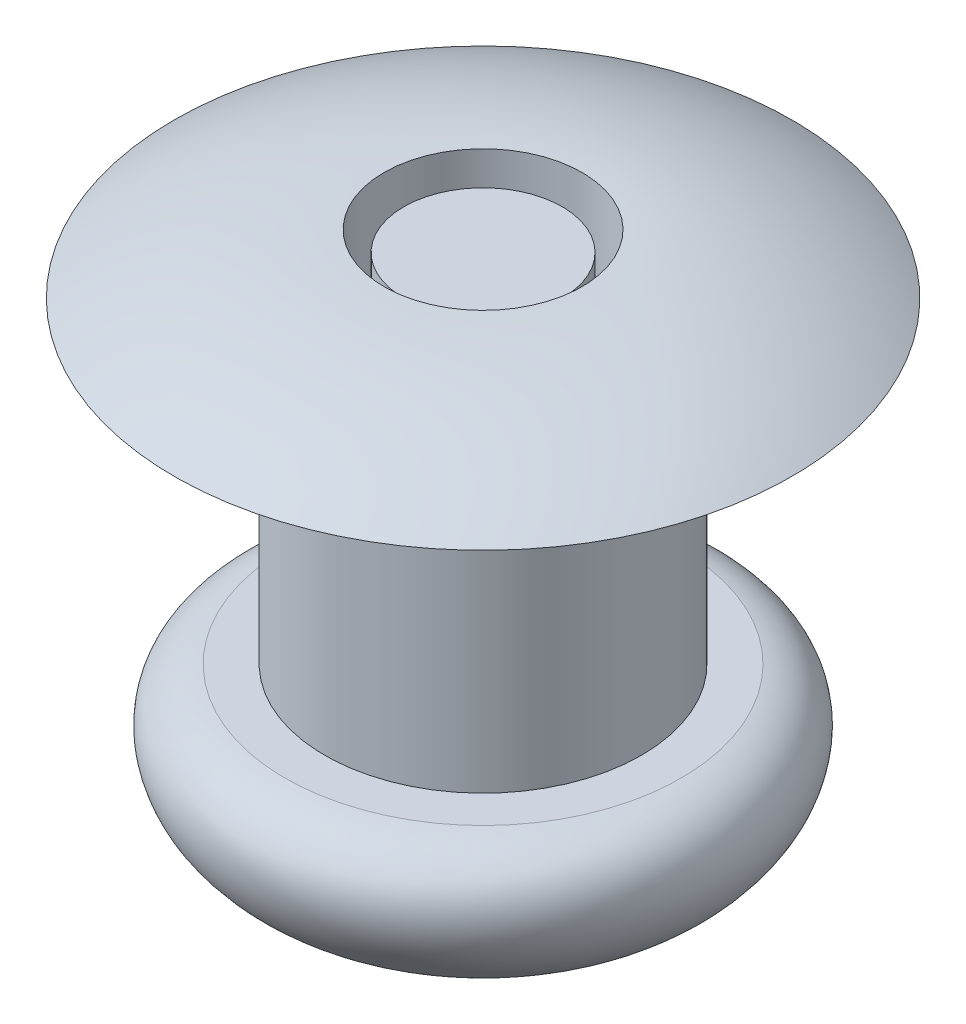
ISO-10303-21;
HEADER;
FILE_DESCRIPTION(('STEP AP214'),'2;1');
FILE_NAME('part.step','',(''),(''),'','','');
FILE_SCHEMA(('AUTOMOTIVE_DESIGN { 1 0 10303 214 1 1 1 1 }'));
ENDSEC;
DATA;
#1=APPLICATION_CONTEXT('core data for automotive mechanical design processes');
#2=APPLICATION_PROTOCOL_DEFINITION('international standard','automotive_design',2000,#1);
#3=PRODUCT_CONTEXT('',#1,'mechanical');
#4=PRODUCT('Part','Part','',(#3));
#5=PRODUCT_RELATED_PRODUCT_CATEGORY('part','',(#4));
#6=PRODUCT_DEFINITION_FORMATION('','',#4);
#7=PRODUCT_DEFINITION_CONTEXT('part definition',#1,'design');
#8=PRODUCT_DEFINITION('design','',#6,#7);
#9=PRODUCT_DEFINITION_SHAPE('','',#8);
#10=(LENGTH_UNIT() NAMED_UNIT(*) SI_UNIT(.MILLI.,.METRE.));
#11=(NAMED_UNIT(*) PLANE_ANGLE_UNIT() SI_UNIT($,.RADIAN.));
#12=(NAMED_UNIT(*) SI_UNIT($,.STERADIAN.) SOLID_ANGLE_UNIT());
#13=UNCERTAINTY_MEASURE_WITH_UNIT(LENGTH_MEASURE(1.E-05),#10,'distance_accuracy_value','');
#14=(GEOMETRIC_REPRESENTATION_CONTEXT(3) GLOBAL_UNCERTAINTY_ASSIGNED_CONTEXT((#13)) GLOBAL_UNIT_ASSIGNED_CONTEXT((#10,
#11,#12)) REPRESENTATION_CONTEXT('',''));
#15=CARTESIAN_POINT('',(0.,0.,0.));
#16=DIRECTION('',(0.,0.,1.));
#17=DIRECTION('',(1.,0.,0.));
#18=AXIS2_PLACEMENT_3D('',#15,#16,#17);
#19=CARTESIAN_POINT('',(0.,-4.30666666666667,0.));
#20=DIRECTION('',(0.,1.,0.));
#21=DIRECTION('',(-1.,0.,0.));
#22=AXIS2_PLACEMENT_3D('',#19,#20,#21);
#23=DEGENERATE_TOROIDAL_SURFACE('',#22,1.25,5.05666666666667,.T.);
#24=CARTESIAN_POINT('',(0.,0.,0.));
#25=DIRECTION('',(0.,1.,0.));
#26=DIRECTION('',(-1.,0.,0.));
#27=AXIS2_PLACEMENT_3D('',#24,#25,#26);
#28=CIRCLE('',#27,3.9);
#29=CARTESIAN_POINT('',(-3.9,0.,0.));
#30=VERTEX_POINT('',#29);
#31=EDGE_CURVE('E11',#30,#30,#28,.T.);
#32=ORIENTED_EDGE('',*,*,#31,.T.);
#33=EDGE_LOOP('',(#32));
#34=FACE_BOUND('',#33,.T.);
#35=CARTESIAN_POINT('',(0.,0.75,0.));
#36=DIRECTION('',(0.,1.,0.));
#37=DIRECTION('',(-1.,0.,0.));
#38=AXIS2_PLACEMENT_3D('',#35,#36,#37);
#39=CIRCLE('',#38,1.25);
#40=CARTESIAN_POINT('',(-1.25,0.75,0.));
#41=VERTEX_POINT('',#40);
#42=EDGE_CURVE('E81',#41,#41,#39,.T.);
#43=ORIENTED_EDGE('',*,*,#42,.F.);
#44=EDGE_LOOP('',(#43));
#45=FACE_BOUND('',#44,.T.);
#46=ADVANCED_FACE('F30',(#34,#45),#23,.T.);
#47=CARTESIAN_POINT('',(-3.9,0.,0.));
#48=DIRECTION('',(0.,-1.,0.));
#49=DIRECTION('',(1.,0.,0.));
#50=AXIS2_PLACEMENT_3D('',#47,#48,#49);
#51=PLANE('',#50);
#52=CARTESIAN_POINT('',(0.,0.,0.));
#53=DIRECTION('',(0.,1.,0.));
#54=DIRECTION('',(-1.,0.,0.));
#55=AXIS2_PLACEMENT_3D('',#52,#53,#54);
#56=CIRCLE('',#55,2.);
#57=CARTESIAN_POINT('',(-2.,0.,0.));
#58=VERTEX_POINT('',#57);
#59=EDGE_CURVE('E36',#58,#58,#56,.T.);
#60=ORIENTED_EDGE('',*,*,#59,.T.);
#61=EDGE_LOOP('',(#60));
#62=FACE_BOUND('',#61,.T.);
#63=ORIENTED_EDGE('',*,*,#31,.F.);
#64=EDGE_LOOP('',(#63));
#65=FACE_BOUND('',#64,.T.);
#66=ADVANCED_FACE('F61',(#62,#65),#51,.T.);
#67=CARTESIAN_POINT('',(0.,0.5,0.));
#68=DIRECTION('',(0.,1.,0.));
#69=DIRECTION('',(-1.,0.,0.));
#70=AXIS2_PLACEMENT_3D('',#67,#68,#69);
#71=CYLINDRICAL_SURFACE('',#70,2.);
#72=CARTESIAN_POINT('',(0.,-4.,0.));
#73=DIRECTION('',(0.,1.,0.));
#74=DIRECTION('',(-1.,0.,0.));
#75=AXIS2_PLACEMENT_3D('',#72,#73,#74);
#76=CIRCLE('',#75,2.);
#77=CARTESIAN_POINT('',(-2.,-4.,0.));
#78=VERTEX_POINT('',#77);
#79=EDGE_CURVE('E49',#78,#78,#76,.T.);
#80=ORIENTED_EDGE('',*,*,#79,.T.);
#81=EDGE_LOOP('',(#80));
#82=FACE_BOUND('',#81,.T.);
#83=ORIENTED_EDGE('',*,*,#59,.F.);
#84=EDGE_LOOP('',(#83));
#85=FACE_BOUND('',#84,.T.);
#86=ADVANCED_FACE('F64',(#82,#85),#71,.T.);
#87=CARTESIAN_POINT('',(-2.,-3.99999999999998,0.));
#88=DIRECTION('',(0.,1.,0.));
#89=DIRECTION('',(-1.,0.,0.));
#90=AXIS2_PLACEMENT_3D('',#87,#88,#89);
#91=PLANE('',#90);
#92=CARTESIAN_POINT('',(0.,-3.99999999999996,0.));
#93=DIRECTION('',(0.,1.,0.));
#94=DIRECTION('',(-1.,0.,0.));
#95=AXIS2_PLACEMENT_3D('',#92,#93,#94);
#96=CIRCLE('',#95,2.5);
#97=CARTESIAN_POINT('',(-2.5,-3.99999999999996,0.));
#98=VERTEX_POINT('',#97);
#99=EDGE_CURVE('E47',#98,#98,#96,.T.);
#100=ORIENTED_EDGE('',*,*,#99,.T.);
#101=EDGE_LOOP('',(#100));
#102=FACE_BOUND('',#101,.T.);
#103=ORIENTED_EDGE('',*,*,#79,.F.);
#104=EDGE_LOOP('',(#103));
#105=FACE_BOUND('',#104,.T.);
#106=ADVANCED_FACE('F43',(#102,#105),#91,.T.);
#107=CARTESIAN_POINT('',(-2.5,-3.99999999999996,0.));
#108=CARTESIAN_POINT('',(-3.32761097394019,-4.14775292745039,0.));
#109=CARTESIAN_POINT('',(-3.25490782709881,-5.96543310118173,0.));
#110=CARTESIAN_POINT('',(-0.030071268354575,-6.37678997472578,0.));
#111=CARTESIAN_POINT('',(-1.22899897091976,-4.32499563135928,0.));
#112=CARTESIAN_POINT('',(-0.216890965209562,-5.49122940777699,0.));
#113=CARTESIAN_POINT('',(0.,-5.42152304510539,0.));
#114=B_SPLINE_CURVE_WITH_KNOTS('',3,(#107,#108,#109,#110,#111,#112,#113),.UNSPECIFIED.,.F.,.F.,
(4,1,1,1,4),(0.,0.343812161723674,0.687238793665517,0.819798770245989,1.),.UNSPECIFIED.);
#115=CARTESIAN_POINT('',(0.,0.5,0.));
#116=DIRECTION('',(0.,1.,0.));
#117=AXIS1_PLACEMENT('',#115,#116);
#118=SURFACE_OF_REVOLUTION('',#114,#117);
#119=CARTESIAN_POINT('',(0.,-5.42152304510543,0.));
#120=VERTEX_POINT('',#119);
#121=VERTEX_LOOP('',#120);
#122=FACE_BOUND('',#121,.T.);
#123=ORIENTED_EDGE('',*,*,#99,.F.);
#124=EDGE_LOOP('',(#123));
#125=FACE_BOUND('',#124,.T.);
#126=ADVANCED_FACE('F39',(#122,#125),#118,.F.);
#127=CARTESIAN_POINT('',(-1.,0.5,0.));
#128=DIRECTION('',(0.,1.,0.));
#129=DIRECTION('',(-1.,0.,0.));
#130=AXIS2_PLACEMENT_3D('',#127,#128,#129);
#131=PLANE('',#130);
#132=CARTESIAN_POINT('',(0.,0.5,0.));
#133=DIRECTION('',(0.,1.,0.));
#134=DIRECTION('',(-1.,0.,0.));
#135=AXIS2_PLACEMENT_3D('',#132,#133,#134);
#136=CIRCLE('',#135,1.);
#137=CARTESIAN_POINT('',(-1.,0.5,0.));
#138=VERTEX_POINT('',#137);
#139=EDGE_CURVE('E50',#138,#138,#136,.T.);
#140=ORIENTED_EDGE('',*,*,#139,.T.);
#141=EDGE_LOOP('',(#140));
#142=FACE_BOUND('',#141,.T.);
#143=ADVANCED_FACE('F42',(#142),#131,.T.);
#144=CARTESIAN_POINT('',(0.,0.5,0.));
#145=DIRECTION('',(0.,1.,0.));
#146=DIRECTION('',(-1.,0.,0.));
#147=AXIS2_PLACEMENT_3D('',#144,#145,#146);
#148=CYLINDRICAL_SURFACE('',#147,1.);
#149=CARTESIAN_POINT('',(0.,-4.,0.));
#150=DIRECTION('',(0.,1.,0.));
#151=DIRECTION('',(-1.,0.,0.));
#152=AXIS2_PLACEMENT_3D('',#149,#150,#151);
#153=CIRCLE('',#152,1.);
#154=CARTESIAN_POINT('',(-1.,-4.,0.));
#155=VERTEX_POINT('',#154);
#156=EDGE_CURVE('E55',#155,#155,#153,.T.);
#157=ORIENTED_EDGE('',*,*,#156,.T.);
#158=EDGE_LOOP('',(#157));
#159=FACE_BOUND('',#158,.T.);
#160=ORIENTED_EDGE('',*,*,#139,.F.);
#161=EDGE_LOOP('',(#160));
#162=FACE_BOUND('',#161,.T.);
#163=ADVANCED_FACE('F94',(#159,#162),#148,.T.);
#164=CARTESIAN_POINT('',(-1.25,-4.,0.));
#165=DIRECTION('',(0.,1.,0.));
#166=DIRECTION('',(-1.,0.,0.));
#167=AXIS2_PLACEMENT_3D('',#164,#165,#166);
#168=PLANE('',#167);
#169=CARTESIAN_POINT('',(0.,-4.,0.));
#170=DIRECTION('',(0.,1.,0.));
#171=DIRECTION('',(-1.,0.,0.));
#172=AXIS2_PLACEMENT_3D('',#169,#170,#171);
#173=CIRCLE('',#172,1.25);
#174=CARTESIAN_POINT('',(-1.25,-4.,0.));
#175=VERTEX_POINT('',#174);
#176=EDGE_CURVE('E83',#175,#175,#173,.T.);
#177=ORIENTED_EDGE('',*,*,#176,.T.);
#178=EDGE_LOOP('',(#177));
#179=FACE_BOUND('',#178,.T.);
#180=ORIENTED_EDGE('',*,*,#156,.F.);
#181=EDGE_LOOP('',(#180));
#182=FACE_BOUND('',#181,.T.);
#183=ADVANCED_FACE('F97',(#179,#182),#168,.T.);
#184=CARTESIAN_POINT('',(0.,0.5,0.));
#185=DIRECTION('',(0.,1.,0.));
#186=DIRECTION('',(-1.,0.,0.));
#187=AXIS2_PLACEMENT_3D('',#184,#185,#186);
#188=CYLINDRICAL_SURFACE('',#187,1.25);
#189=ORIENTED_EDGE('',*,*,#42,.T.);
#190=EDGE_LOOP('',(#189));
#191=FACE_BOUND('',#190,.T.);
#192=ORIENTED_EDGE('',*,*,#176,.F.);
#193=EDGE_LOOP('',(#192));
#194=FACE_BOUND('',#193,.T.);
#195=ADVANCED_FACE('F99',(#191,#194),#188,.F.);
#196=CLOSED_SHELL('',(#46,#66,#86,#106,#126,#143,#163,#183,#195));
#197=MANIFOLD_SOLID_BREP('B2',#196);
#198=ADVANCED_BREP_SHAPE_REPRESENTATION('',(#18,#197),#14);
#199=SHAPE_DEFINITION_REPRESENTATION(#9,#198);
ENDSEC;
END-ISO-10303-21;
